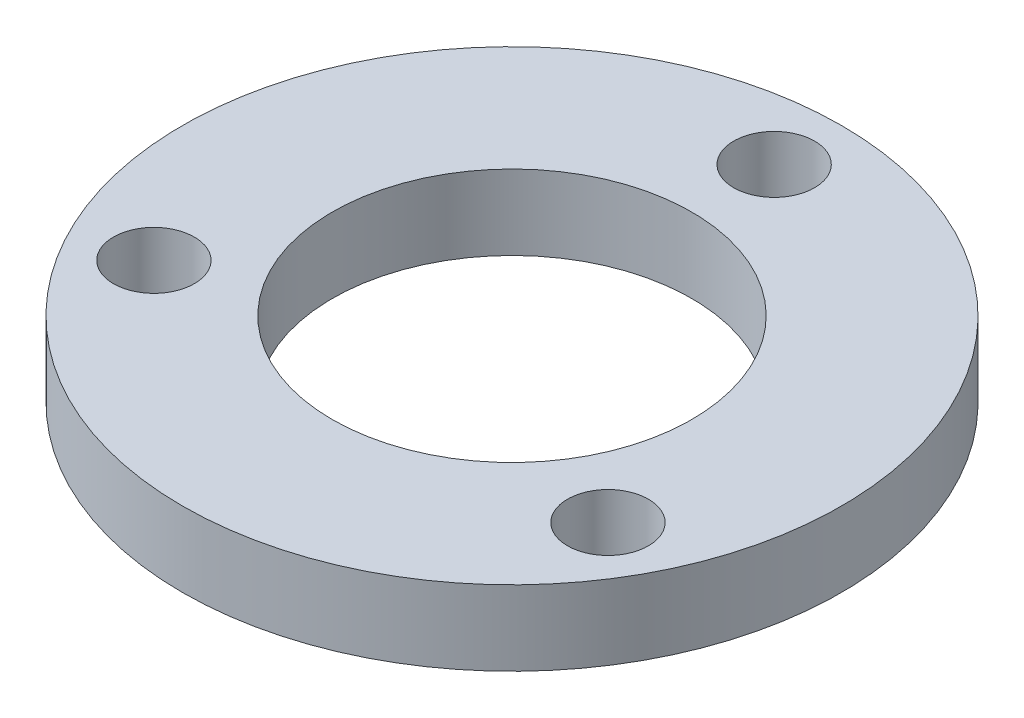
ISO-10303-21;
HEADER;
FILE_DESCRIPTION(('STEP AP214'),'2;1');
FILE_NAME('part.step','',(''),(''),'','','');
FILE_SCHEMA(('AUTOMOTIVE_DESIGN { 1 0 10303 214 1 1 1 1 }'));
ENDSEC;
DATA;
#1=APPLICATION_CONTEXT('core data for automotive mechanical design processes');
#2=APPLICATION_PROTOCOL_DEFINITION('international standard','automotive_design',2000,#1);
#3=PRODUCT_CONTEXT('',#1,'mechanical');
#4=PRODUCT('Part','Part','',(#3));
#5=PRODUCT_RELATED_PRODUCT_CATEGORY('part','',(#4));
#6=PRODUCT_DEFINITION_FORMATION('','',#4);
#7=PRODUCT_DEFINITION_CONTEXT('part definition',#1,'design');
#8=PRODUCT_DEFINITION('design','',#6,#7);
#9=PRODUCT_DEFINITION_SHAPE('','',#8);
#10=(LENGTH_UNIT() NAMED_UNIT(*) SI_UNIT(.MILLI.,.METRE.));
#11=(NAMED_UNIT(*) PLANE_ANGLE_UNIT() SI_UNIT($,.RADIAN.));
#12=(NAMED_UNIT(*) SI_UNIT($,.STERADIAN.) SOLID_ANGLE_UNIT());
#13=UNCERTAINTY_MEASURE_WITH_UNIT(LENGTH_MEASURE(1.E-05),#10,'distance_accuracy_value','');
#14=(GEOMETRIC_REPRESENTATION_CONTEXT(3) GLOBAL_UNCERTAINTY_ASSIGNED_CONTEXT((#13)) GLOBAL_UNIT_ASSIGNED_CONTEXT((#10,
#11,#12)) REPRESENTATION_CONTEXT('',''));
#15=CARTESIAN_POINT('',(0.,0.,0.));
#16=DIRECTION('',(0.,0.,1.));
#17=DIRECTION('',(1.,0.,0.));
#18=AXIS2_PLACEMENT_3D('',#15,#16,#17);
#19=CARTESIAN_POINT('',(0.,5.,0.));
#20=DIRECTION('',(0.,-1.,0.));
#21=DIRECTION('',(0.,0.,-1.));
#22=AXIS2_PLACEMENT_3D('',#19,#20,#21);
#23=CYLINDRICAL_SURFACE('',#22,12.);
#24=CARTESIAN_POINT('',(0.,5.,0.));
#25=DIRECTION('',(0.,1.,0.));
#26=DIRECTION('',(0.,0.,1.));
#27=AXIS2_PLACEMENT_3D('',#24,#25,#26);
#28=CIRCLE('',#27,12.);
#29=CARTESIAN_POINT('',(0.,5.,12.));
#30=VERTEX_POINT('',#29);
#31=EDGE_CURVE('E48',#30,#30,#28,.T.);
#32=ORIENTED_EDGE('',*,*,#31,.T.);
#33=EDGE_LOOP('',(#32));
#34=FACE_BOUND('',#33,.T.);
#35=CARTESIAN_POINT('',(0.,0.,0.));
#36=DIRECTION('',(0.,1.,0.));
#37=DIRECTION('',(0.,0.,1.));
#38=AXIS2_PLACEMENT_3D('',#35,#36,#37);
#39=CIRCLE('',#38,12.);
#40=CARTESIAN_POINT('',(0.,0.,12.));
#41=VERTEX_POINT('',#40);
#42=EDGE_CURVE('E55',#41,#41,#39,.T.);
#43=ORIENTED_EDGE('',*,*,#42,.F.);
#44=EDGE_LOOP('',(#43));
#45=FACE_BOUND('',#44,.T.);
#46=ADVANCED_FACE('F41',(#34,#45),#23,.F.);
#47=CARTESIAN_POINT('',(0.,5.,0.));
#48=DIRECTION('',(0.,-1.,0.));
#49=DIRECTION('',(0.,0.,-1.));
#50=AXIS2_PLACEMENT_3D('',#47,#48,#49);
#51=CYLINDRICAL_SURFACE('',#50,22.);
#52=CARTESIAN_POINT('',(0.,5.,0.));
#53=DIRECTION('',(0.,1.,0.));
#54=DIRECTION('',(0.,0.,1.));
#55=AXIS2_PLACEMENT_3D('',#52,#53,#54);
#56=CIRCLE('',#55,22.);
#57=CARTESIAN_POINT('',(0.,5.,22.));
#58=VERTEX_POINT('',#57);
#59=EDGE_CURVE('E10',#58,#58,#56,.T.);
#60=ORIENTED_EDGE('',*,*,#59,.F.);
#61=EDGE_LOOP('',(#60));
#62=FACE_BOUND('',#61,.T.);
#63=CARTESIAN_POINT('',(0.,0.,0.));
#64=DIRECTION('',(0.,1.,0.));
#65=DIRECTION('',(0.,0.,1.));
#66=AXIS2_PLACEMENT_3D('',#63,#64,#65);
#67=CIRCLE('',#66,22.);
#68=CARTESIAN_POINT('',(0.,0.,22.));
#69=VERTEX_POINT('',#68);
#70=EDGE_CURVE('E44',#69,#69,#67,.T.);
#71=ORIENTED_EDGE('',*,*,#70,.T.);
#72=EDGE_LOOP('',(#71));
#73=FACE_BOUND('',#72,.T.);
#74=ADVANCED_FACE('F88',(#62,#73),#51,.T.);
#75=CARTESIAN_POINT('',(0.,5.,0.));
#76=DIRECTION('',(0.,1.,0.));
#77=DIRECTION('',(0.,0.,1.));
#78=AXIS2_PLACEMENT_3D('',#75,#76,#77);
#79=PLANE('',#78);
#80=CARTESIAN_POINT('',(-15.1554445662276,5.,8.75000000000007));
#81=DIRECTION('',(0.,1.,0.));
#82=DIRECTION('',(0.866025403784436,0.,-0.500000000000004));
#83=AXIS2_PLACEMENT_3D('',#80,#81,#82);
#84=CIRCLE('',#83,2.7);
#85=CARTESIAN_POINT('',(-12.8171759760097,5.,7.40000000000006));
#86=VERTEX_POINT('',#85);
#87=EDGE_CURVE('E67',#86,#86,#84,.T.);
#88=ORIENTED_EDGE('',*,*,#87,.F.);
#89=EDGE_LOOP('',(#88));
#90=FACE_BOUND('',#89,.T.);
#91=CARTESIAN_POINT('',(15.1554445662278,5.,8.74999999999986));
#92=DIRECTION('',(0.,1.,0.));
#93=DIRECTION('',(-0.866025403784443,0.,-0.499999999999992));
#94=AXIS2_PLACEMENT_3D('',#91,#92,#93);
#95=CIRCLE('',#94,2.7);
#96=CARTESIAN_POINT('',(12.8171759760098,5.,7.39999999999988));
#97=VERTEX_POINT('',#96);
#98=EDGE_CURVE('E72',#97,#97,#95,.T.);
#99=ORIENTED_EDGE('',*,*,#98,.F.);
#100=EDGE_LOOP('',(#99));
#101=FACE_BOUND('',#100,.T.);
#102=CARTESIAN_POINT('',(0.,5.,-17.5));
#103=DIRECTION('',(0.,1.,0.));
#104=DIRECTION('',(0.,0.,1.));
#105=AXIS2_PLACEMENT_3D('',#102,#103,#104);
#106=CIRCLE('',#105,2.7);
#107=CARTESIAN_POINT('',(0.,5.,-14.8));
#108=VERTEX_POINT('',#107);
#109=EDGE_CURVE('E57',#108,#108,#106,.T.);
#110=ORIENTED_EDGE('',*,*,#109,.F.);
#111=EDGE_LOOP('',(#110));
#112=FACE_BOUND('',#111,.T.);
#113=ORIENTED_EDGE('',*,*,#31,.F.);
#114=EDGE_LOOP('',(#113));
#115=FACE_BOUND('',#114,.T.);
#116=ORIENTED_EDGE('',*,*,#59,.T.);
#117=EDGE_LOOP('',(#116));
#118=FACE_BOUND('',#117,.T.);
#119=ADVANCED_FACE('F84',(#90,#101,#112,#115,#118),#79,.T.);
#120=CARTESIAN_POINT('',(0.,0.,0.));
#121=DIRECTION('',(0.,1.,0.));
#122=DIRECTION('',(0.,0.,1.));
#123=AXIS2_PLACEMENT_3D('',#120,#121,#122);
#124=PLANE('',#123);
#125=CARTESIAN_POINT('',(-15.1554445662276,0.,8.75000000000007));
#126=DIRECTION('',(0.,1.,0.));
#127=DIRECTION('',(0.866025403784436,0.,-0.500000000000004));
#128=AXIS2_PLACEMENT_3D('',#125,#126,#127);
#129=CIRCLE('',#128,2.7);
#130=CARTESIAN_POINT('',(-12.8171759760097,0.,7.40000000000006));
#131=VERTEX_POINT('',#130);
#132=EDGE_CURVE('E75',#131,#131,#129,.T.);
#133=ORIENTED_EDGE('',*,*,#132,.T.);
#134=EDGE_LOOP('',(#133));
#135=FACE_BOUND('',#134,.T.);
#136=CARTESIAN_POINT('',(15.1554445662278,0.,8.74999999999986));
#137=DIRECTION('',(0.,1.,0.));
#138=DIRECTION('',(-0.866025403784443,0.,-0.499999999999992));
#139=AXIS2_PLACEMENT_3D('',#136,#137,#138);
#140=CIRCLE('',#139,2.7);
#141=CARTESIAN_POINT('',(12.8171759760098,0.,7.39999999999988));
#142=VERTEX_POINT('',#141);
#143=EDGE_CURVE('E69',#142,#142,#140,.T.);
#144=ORIENTED_EDGE('',*,*,#143,.T.);
#145=EDGE_LOOP('',(#144));
#146=FACE_BOUND('',#145,.T.);
#147=CARTESIAN_POINT('',(0.,0.,-17.5));
#148=DIRECTION('',(0.,1.,0.));
#149=DIRECTION('',(0.,0.,1.));
#150=AXIS2_PLACEMENT_3D('',#147,#148,#149);
#151=CIRCLE('',#150,2.7);
#152=CARTESIAN_POINT('',(0.,0.,-14.8));
#153=VERTEX_POINT('',#152);
#154=EDGE_CURVE('E62',#153,#153,#151,.T.);
#155=ORIENTED_EDGE('',*,*,#154,.T.);
#156=EDGE_LOOP('',(#155));
#157=FACE_BOUND('',#156,.T.);
#158=ORIENTED_EDGE('',*,*,#42,.T.);
#159=EDGE_LOOP('',(#158));
#160=FACE_BOUND('',#159,.T.);
#161=ORIENTED_EDGE('',*,*,#70,.F.);
#162=EDGE_LOOP('',(#161));
#163=FACE_BOUND('',#162,.T.);
#164=ADVANCED_FACE('F87',(#135,#146,#157,#160,#163),#124,.F.);
#165=CARTESIAN_POINT('',(0.,5.,-17.5));
#166=DIRECTION('',(0.,-1.,0.));
#167=DIRECTION('',(0.,0.,-1.));
#168=AXIS2_PLACEMENT_3D('',#165,#166,#167);
#169=CYLINDRICAL_SURFACE('',#168,2.7);
#170=ORIENTED_EDGE('',*,*,#109,.T.);
#171=EDGE_LOOP('',(#170));
#172=FACE_BOUND('',#171,.T.);
#173=ORIENTED_EDGE('',*,*,#154,.F.);
#174=EDGE_LOOP('',(#173));
#175=FACE_BOUND('',#174,.T.);
#176=ADVANCED_FACE('F107',(#172,#175),#169,.F.);
#177=CARTESIAN_POINT('',(15.1554445662278,5.,8.74999999999986));
#178=DIRECTION('',(0.,-1.,0.));
#179=DIRECTION('',(0.,0.,-1.));
#180=AXIS2_PLACEMENT_3D('',#177,#178,#179);
#181=CYLINDRICAL_SURFACE('',#180,2.7);
#182=ORIENTED_EDGE('',*,*,#98,.T.);
#183=EDGE_LOOP('',(#182));
#184=FACE_BOUND('',#183,.T.);
#185=ORIENTED_EDGE('',*,*,#143,.F.);
#186=EDGE_LOOP('',(#185));
#187=FACE_BOUND('',#186,.T.);
#188=ADVANCED_FACE('F111',(#184,#187),#181,.F.);
#189=CARTESIAN_POINT('',(-15.1554445662276,5.,8.75000000000007));
#190=DIRECTION('',(0.,-1.,0.));
#191=DIRECTION('',(0.,0.,-1.));
#192=AXIS2_PLACEMENT_3D('',#189,#190,#191);
#193=CYLINDRICAL_SURFACE('',#192,2.7);
#194=ORIENTED_EDGE('',*,*,#87,.T.);
#195=EDGE_LOOP('',(#194));
#196=FACE_BOUND('',#195,.T.);
#197=ORIENTED_EDGE('',*,*,#132,.F.);
#198=EDGE_LOOP('',(#197));
#199=FACE_BOUND('',#198,.T.);
#200=ADVANCED_FACE('F81',(#196,#199),#193,.F.);
#201=CLOSED_SHELL('',(#46,#74,#119,#164,#176,#188,#200));
#202=MANIFOLD_SOLID_BREP('B2',#201);
#203=ADVANCED_BREP_SHAPE_REPRESENTATION('',(#18,#202),#14);
#204=SHAPE_DEFINITION_REPRESENTATION(#9,#203);
ENDSEC;
END-ISO-10303-21;
